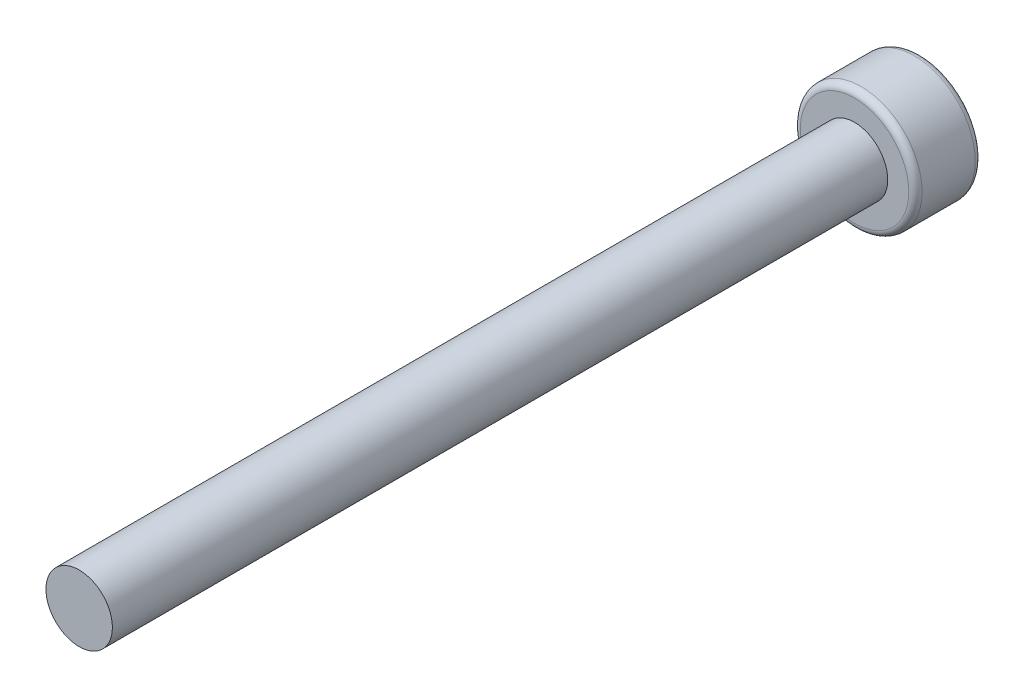
ISO-10303-21;
HEADER;
FILE_DESCRIPTION(('STEP AP214'),'2;1');
FILE_NAME('part.step','',(''),(''),'','','');
FILE_SCHEMA(('AUTOMOTIVE_DESIGN { 1 0 10303 214 1 1 1 1 }'));
ENDSEC;
DATA;
#1=APPLICATION_CONTEXT('core data for automotive mechanical design processes');
#2=APPLICATION_PROTOCOL_DEFINITION('international standard','automotive_design',2000,#1);
#3=PRODUCT_CONTEXT('',#1,'mechanical');
#4=PRODUCT('Part','Part','',(#3));
#5=PRODUCT_RELATED_PRODUCT_CATEGORY('part','',(#4));
#6=PRODUCT_DEFINITION_FORMATION('','',#4);
#7=PRODUCT_DEFINITION_CONTEXT('part definition',#1,'design');
#8=PRODUCT_DEFINITION('design','',#6,#7);
#9=PRODUCT_DEFINITION_SHAPE('','',#8);
#10=(LENGTH_UNIT() NAMED_UNIT(*) SI_UNIT(.MILLI.,.METRE.));
#11=(NAMED_UNIT(*) PLANE_ANGLE_UNIT() SI_UNIT($,.RADIAN.));
#12=(NAMED_UNIT(*) SI_UNIT($,.STERADIAN.) SOLID_ANGLE_UNIT());
#13=UNCERTAINTY_MEASURE_WITH_UNIT(LENGTH_MEASURE(1.E-05),#10,'distance_accuracy_value','');
#14=(GEOMETRIC_REPRESENTATION_CONTEXT(3) GLOBAL_UNCERTAINTY_ASSIGNED_CONTEXT((#13)) GLOBAL_UNIT_ASSIGNED_CONTEXT((#10,
#11,#12)) REPRESENTATION_CONTEXT('',''));
#15=CARTESIAN_POINT('',(0.,0.,0.));
#16=DIRECTION('',(0.,0.,1.));
#17=DIRECTION('',(1.,0.,0.));
#18=AXIS2_PLACEMENT_3D('',#15,#16,#17);
#19=CARTESIAN_POINT('',(0.,0.,3.));
#20=DIRECTION('',(0.,0.,-1.));
#21=DIRECTION('',(-1.,0.,0.));
#22=AXIS2_PLACEMENT_3D('',#19,#20,#21);
#23=CYLINDRICAL_SURFACE('',#22,2.75);
#24=CARTESIAN_POINT('',(0.,0.,0.3));
#25=DIRECTION('',(0.,0.,1.));
#26=DIRECTION('',(1.,0.,0.));
#27=AXIS2_PLACEMENT_3D('',#24,#25,#26);
#28=CIRCLE('',#27,2.75);
#29=CARTESIAN_POINT('',(2.75,0.,0.3));
#30=VERTEX_POINT('',#29);
#31=EDGE_CURVE('E155',#30,#30,#28,.T.);
#32=ORIENTED_EDGE('',*,*,#31,.T.);
#33=EDGE_LOOP('',(#32));
#34=FACE_BOUND('',#33,.T.);
#35=CARTESIAN_POINT('',(0.,0.,2.7));
#36=DIRECTION('',(0.,0.,1.));
#37=DIRECTION('',(1.,0.,0.));
#38=AXIS2_PLACEMENT_3D('',#35,#36,#37);
#39=CIRCLE('',#38,2.75);
#40=CARTESIAN_POINT('',(2.75,0.,2.7));
#41=VERTEX_POINT('',#40);
#42=EDGE_CURVE('E152',#41,#41,#39,.F.);
#43=ORIENTED_EDGE('',*,*,#42,.T.);
#44=EDGE_LOOP('',(#43));
#45=FACE_BOUND('',#44,.T.);
#46=ADVANCED_FACE('F39',(#34,#45),#23,.T.);
#47=CARTESIAN_POINT('',(0.,0.,3.));
#48=DIRECTION('',(0.,0.,1.));
#49=DIRECTION('',(1.,0.,0.));
#50=AXIS2_PLACEMENT_3D('',#47,#48,#49);
#51=PLANE('',#50);
#52=CARTESIAN_POINT('',(0.,0.,3.));
#53=DIRECTION('',(0.,0.,1.));
#54=DIRECTION('',(1.,0.,0.));
#55=AXIS2_PLACEMENT_3D('',#52,#53,#54);
#56=CIRCLE('',#55,2.45);
#57=CARTESIAN_POINT('',(2.45,0.,3.));
#58=VERTEX_POINT('',#57);
#59=EDGE_CURVE('E11',#58,#58,#56,.T.);
#60=ORIENTED_EDGE('',*,*,#59,.T.);
#61=EDGE_LOOP('',(#60));
#62=FACE_BOUND('',#61,.T.);
#63=CARTESIAN_POINT('',(0.,0.,3.));
#64=DIRECTION('',(0.,0.,1.));
#65=DIRECTION('',(1.,0.,0.));
#66=AXIS2_PLACEMENT_3D('',#63,#64,#65);
#67=CIRCLE('',#66,1.5);
#68=CARTESIAN_POINT('',(1.5,0.,3.));
#69=VERTEX_POINT('',#68);
#70=EDGE_CURVE('E149',#69,#69,#67,.T.);
#71=ORIENTED_EDGE('',*,*,#70,.F.);
#72=EDGE_LOOP('',(#71));
#73=FACE_BOUND('',#72,.T.);
#74=ADVANCED_FACE('F170',(#62,#73),#51,.T.);
#75=CARTESIAN_POINT('',(0.,0.,0.));
#76=DIRECTION('',(0.,0.,1.));
#77=DIRECTION('',(1.,0.,0.));
#78=AXIS2_PLACEMENT_3D('',#75,#76,#77);
#79=PLANE('',#78);
#80=DIRECTION('',(0.590811113127551,-0.806809908593706,0.));
#81=VECTOR('',#80,1.);
#82=CARTESIAN_POINT('',(0.820853493075304,1.8624081611757,0.));
#83=LINE('',#82,#81);
#84=CARTESIAN_POINT('',(0.820853493075304,1.8624081611757,0.));
#85=VERTEX_POINT('',#84);
#86=CARTESIAN_POINT('',(2.02331952633127,0.220324102799441,0.));
#87=VERTEX_POINT('',#86);
#88=EDGE_CURVE('E128',#85,#87,#83,.T.);
#89=ORIENTED_EDGE('',*,*,#88,.F.);
#90=DIRECTION('',(0.994123433430926,0.108252478509768,0.));
#91=VECTOR('',#90,1.);
#92=CARTESIAN_POINT('',(-1.20246603325596,1.64208405837626,0.));
#93=LINE('',#92,#91);
#94=CARTESIAN_POINT('',(-1.20246603325596,1.64208405837626,0.));
#95=VERTEX_POINT('',#94);
#96=EDGE_CURVE('E54',#95,#85,#93,.T.);
#97=ORIENTED_EDGE('',*,*,#96,.F.);
#98=DIRECTION('',(0.403312320303375,0.915062387103474,0.));
#99=VECTOR('',#98,1.);
#100=CARTESIAN_POINT('',(-2.02331952633127,-0.220324102799442,0.));
#101=LINE('',#100,#99);
#102=CARTESIAN_POINT('',(-2.02331952633127,-0.220324102799442,0.));
#103=VERTEX_POINT('',#102);
#104=EDGE_CURVE('E137',#103,#95,#101,.T.);
#105=ORIENTED_EDGE('',*,*,#104,.F.);
#106=DIRECTION('',(-0.590811113127551,0.806809908593706,0.));
#107=VECTOR('',#106,1.);
#108=CARTESIAN_POINT('',(-0.820853493075303,-1.8624081611757,0.));
#109=LINE('',#108,#107);
#110=CARTESIAN_POINT('',(-0.820853493075303,-1.8624081611757,0.));
#111=VERTEX_POINT('',#110);
#112=EDGE_CURVE('E135',#111,#103,#109,.T.);
#113=ORIENTED_EDGE('',*,*,#112,.F.);
#114=DIRECTION('',(-0.994123433430926,-0.108252478509768,0.));
#115=VECTOR('',#114,1.);
#116=CARTESIAN_POINT('',(1.20246603325596,-1.64208405837625,0.));
#117=LINE('',#116,#115);
#118=CARTESIAN_POINT('',(1.20246603325596,-1.64208405837625,0.));
#119=VERTEX_POINT('',#118);
#120=EDGE_CURVE('E102',#119,#111,#117,.T.);
#121=ORIENTED_EDGE('',*,*,#120,.F.);
#122=DIRECTION('',(-0.403312320303375,-0.915062387103474,0.));
#123=VECTOR('',#122,1.);
#124=CARTESIAN_POINT('',(2.02331952633127,0.220324102799441,0.));
#125=LINE('',#124,#123);
#126=EDGE_CURVE('E131',#87,#119,#125,.T.);
#127=ORIENTED_EDGE('',*,*,#126,.F.);
#128=EDGE_LOOP('',(#89,#97,#105,#113,#121,#127));
#129=FACE_BOUND('',#128,.T.);
#130=CARTESIAN_POINT('',(0.,0.,0.));
#131=DIRECTION('',(0.,0.,1.));
#132=DIRECTION('',(1.,0.,0.));
#133=AXIS2_PLACEMENT_3D('',#130,#131,#132);
#134=CIRCLE('',#133,2.45);
#135=CARTESIAN_POINT('',(2.45,0.,0.));
#136=VERTEX_POINT('',#135);
#137=EDGE_CURVE('E47',#136,#136,#134,.F.);
#138=ORIENTED_EDGE('',*,*,#137,.T.);
#139=EDGE_LOOP('',(#138));
#140=FACE_BOUND('',#139,.T.);
#141=ADVANCED_FACE('F160',(#129,#140),#79,.F.);
#142=CARTESIAN_POINT('',(0.,0.,38.));
#143=DIRECTION('',(0.,0.,-1.));
#144=DIRECTION('',(-1.,0.,0.));
#145=AXIS2_PLACEMENT_3D('',#142,#143,#144);
#146=CYLINDRICAL_SURFACE('',#145,1.5);
#147=CARTESIAN_POINT('',(0.,0.,38.));
#148=DIRECTION('',(0.,0.,1.));
#149=DIRECTION('',(1.,0.,0.));
#150=AXIS2_PLACEMENT_3D('',#147,#148,#149);
#151=CIRCLE('',#150,1.5);
#152=CARTESIAN_POINT('',(1.5,0.,38.));
#153=VERTEX_POINT('',#152);
#154=EDGE_CURVE('E141',#153,#153,#151,.T.);
#155=ORIENTED_EDGE('',*,*,#154,.F.);
#156=EDGE_LOOP('',(#155));
#157=FACE_BOUND('',#156,.T.);
#158=ORIENTED_EDGE('',*,*,#70,.T.);
#159=EDGE_LOOP('',(#158));
#160=FACE_BOUND('',#159,.T.);
#161=ADVANCED_FACE('F184',(#157,#160),#146,.T.);
#162=CARTESIAN_POINT('',(0.,0.,38.));
#163=DIRECTION('',(0.,0.,1.));
#164=DIRECTION('',(1.,0.,0.));
#165=AXIS2_PLACEMENT_3D('',#162,#163,#164);
#166=PLANE('',#165);
#167=ORIENTED_EDGE('',*,*,#154,.T.);
#168=EDGE_LOOP('',(#167));
#169=FACE_BOUND('',#168,.T.);
#170=ADVANCED_FACE('F165',(#169),#166,.T.);
#171=CARTESIAN_POINT('',(0.,0.,0.3));
#172=DIRECTION('',(0.,0.,1.));
#173=DIRECTION('',(1.,0.,0.));
#174=AXIS2_PLACEMENT_3D('',#171,#172,#173);
#175=TOROIDAL_SURFACE('',#174,2.45,0.3);
#176=ORIENTED_EDGE('',*,*,#137,.F.);
#177=EDGE_LOOP('',(#176));
#178=FACE_BOUND('',#177,.T.);
#179=ORIENTED_EDGE('',*,*,#31,.F.);
#180=EDGE_LOOP('',(#179));
#181=FACE_BOUND('',#180,.T.);
#182=ADVANCED_FACE('F162',(#178,#181),#175,.T.);
#183=CARTESIAN_POINT('',(0.,0.,2.7));
#184=DIRECTION('',(0.,0.,1.));
#185=DIRECTION('',(1.,0.,0.));
#186=AXIS2_PLACEMENT_3D('',#183,#184,#185);
#187=TOROIDAL_SURFACE('',#186,2.45,0.3);
#188=ORIENTED_EDGE('',*,*,#42,.F.);
#189=EDGE_LOOP('',(#188));
#190=FACE_BOUND('',#189,.T.);
#191=ORIENTED_EDGE('',*,*,#59,.F.);
#192=EDGE_LOOP('',(#191));
#193=FACE_BOUND('',#192,.T.);
#194=ADVANCED_FACE('F41',(#190,#193),#187,.T.);
#195=CARTESIAN_POINT('',(-1.20246603325596,1.64208405837626,2.));
#196=DIRECTION('',(-0.108252478509768,0.994123433430926,0.));
#197=DIRECTION('',(-0.994123433430926,-0.108252478509768,0.));
#198=AXIS2_PLACEMENT_3D('',#195,#196,#197);
#199=PLANE('',#198);
#200=ORIENTED_EDGE('',*,*,#96,.T.);
#201=DIRECTION('',(0.,0.,-1.));
#202=VECTOR('',#201,1.);
#203=CARTESIAN_POINT('',(0.820853493075304,1.8624081611757,2.));
#204=LINE('',#203,#202);
#205=CARTESIAN_POINT('',(0.820853493075304,1.8624081611757,2.));
#206=VERTEX_POINT('',#205);
#207=EDGE_CURVE('E84',#206,#85,#204,.T.);
#208=ORIENTED_EDGE('',*,*,#207,.F.);
#209=DIRECTION('',(0.994123433430926,0.108252478509768,0.));
#210=VECTOR('',#209,1.);
#211=CARTESIAN_POINT('',(-1.20246603325596,1.64208405837626,2.));
#212=LINE('',#211,#210);
#213=CARTESIAN_POINT('',(-1.20246603325596,1.64208405837626,2.));
#214=VERTEX_POINT('',#213);
#215=EDGE_CURVE('E139',#214,#206,#212,.T.);
#216=ORIENTED_EDGE('',*,*,#215,.F.);
#217=DIRECTION('',(0.,0.,-1.));
#218=VECTOR('',#217,1.);
#219=CARTESIAN_POINT('',(-1.20246603325596,1.64208405837626,2.));
#220=LINE('',#219,#218);
#221=EDGE_CURVE('E62',#214,#95,#220,.T.);
#222=ORIENTED_EDGE('',*,*,#221,.T.);
#223=EDGE_LOOP('',(#200,#208,#216,#222));
#224=FACE_BOUND('',#223,.T.);
#225=ADVANCED_FACE('F176',(#224),#199,.F.);
#226=CARTESIAN_POINT('',(-2.02331952633127,-0.220324102799442,2.));
#227=DIRECTION('',(-0.915062387103474,0.403312320303375,0.));
#228=DIRECTION('',(-0.403312320303375,-0.915062387103474,0.));
#229=AXIS2_PLACEMENT_3D('',#226,#227,#228);
#230=PLANE('',#229);
#231=ORIENTED_EDGE('',*,*,#104,.T.);
#232=ORIENTED_EDGE('',*,*,#221,.F.);
#233=DIRECTION('',(0.403312320303375,0.915062387103474,0.));
#234=VECTOR('',#233,1.);
#235=CARTESIAN_POINT('',(-2.02331952633127,-0.220324102799442,2.));
#236=LINE('',#235,#234);
#237=CARTESIAN_POINT('',(-2.02331952633127,-0.220324102799442,2.));
#238=VERTEX_POINT('',#237);
#239=EDGE_CURVE('E114',#238,#214,#236,.T.);
#240=ORIENTED_EDGE('',*,*,#239,.F.);
#241=DIRECTION('',(0.,0.,-1.));
#242=VECTOR('',#241,1.);
#243=CARTESIAN_POINT('',(-2.02331952633127,-0.220324102799442,2.));
#244=LINE('',#243,#242);
#245=EDGE_CURVE('E106',#238,#103,#244,.T.);
#246=ORIENTED_EDGE('',*,*,#245,.T.);
#247=EDGE_LOOP('',(#231,#232,#240,#246));
#248=FACE_BOUND('',#247,.T.);
#249=ADVANCED_FACE('F200',(#248),#230,.F.);
#250=CARTESIAN_POINT('',(-0.820853493075303,-1.8624081611757,2.));
#251=DIRECTION('',(-0.806809908593706,-0.590811113127551,0.));
#252=DIRECTION('',(0.590811113127551,-0.806809908593706,0.));
#253=AXIS2_PLACEMENT_3D('',#250,#251,#252);
#254=PLANE('',#253);
#255=ORIENTED_EDGE('',*,*,#112,.T.);
#256=ORIENTED_EDGE('',*,*,#245,.F.);
#257=DIRECTION('',(-0.590811113127551,0.806809908593706,0.));
#258=VECTOR('',#257,1.);
#259=CARTESIAN_POINT('',(-0.820853493075303,-1.8624081611757,2.));
#260=LINE('',#259,#258);
#261=CARTESIAN_POINT('',(-0.820853493075303,-1.8624081611757,2.));
#262=VERTEX_POINT('',#261);
#263=EDGE_CURVE('E110',#262,#238,#260,.T.);
#264=ORIENTED_EDGE('',*,*,#263,.F.);
#265=DIRECTION('',(0.,0.,-1.));
#266=VECTOR('',#265,1.);
#267=CARTESIAN_POINT('',(-0.820853493075303,-1.8624081611757,2.));
#268=LINE('',#267,#266);
#269=EDGE_CURVE('E95',#262,#111,#268,.T.);
#270=ORIENTED_EDGE('',*,*,#269,.T.);
#271=EDGE_LOOP('',(#255,#256,#264,#270));
#272=FACE_BOUND('',#271,.T.);
#273=ADVANCED_FACE('F111',(#272),#254,.F.);
#274=CARTESIAN_POINT('',(1.20246603325596,-1.64208405837625,2.));
#275=DIRECTION('',(0.108252478509768,-0.994123433430926,0.));
#276=DIRECTION('',(0.994123433430926,0.108252478509768,0.));
#277=AXIS2_PLACEMENT_3D('',#274,#275,#276);
#278=PLANE('',#277);
#279=ORIENTED_EDGE('',*,*,#120,.T.);
#280=ORIENTED_EDGE('',*,*,#269,.F.);
#281=DIRECTION('',(-0.994123433430926,-0.108252478509768,0.));
#282=VECTOR('',#281,1.);
#283=CARTESIAN_POINT('',(1.20246603325596,-1.64208405837625,2.));
#284=LINE('',#283,#282);
#285=CARTESIAN_POINT('',(1.20246603325596,-1.64208405837625,2.));
#286=VERTEX_POINT('',#285);
#287=EDGE_CURVE('E99',#286,#262,#284,.T.);
#288=ORIENTED_EDGE('',*,*,#287,.F.);
#289=DIRECTION('',(0.,0.,-1.));
#290=VECTOR('',#289,1.);
#291=CARTESIAN_POINT('',(1.20246603325596,-1.64208405837625,2.));
#292=LINE('',#291,#290);
#293=EDGE_CURVE('E107',#286,#119,#292,.T.);
#294=ORIENTED_EDGE('',*,*,#293,.T.);
#295=EDGE_LOOP('',(#279,#280,#288,#294));
#296=FACE_BOUND('',#295,.T.);
#297=ADVANCED_FACE('F97',(#296),#278,.F.);
#298=CARTESIAN_POINT('',(2.02331952633127,0.220324102799441,2.));
#299=DIRECTION('',(0.915062387103474,-0.403312320303375,0.));
#300=DIRECTION('',(0.403312320303375,0.915062387103474,0.));
#301=AXIS2_PLACEMENT_3D('',#298,#299,#300);
#302=PLANE('',#301);
#303=ORIENTED_EDGE('',*,*,#126,.T.);
#304=ORIENTED_EDGE('',*,*,#293,.F.);
#305=DIRECTION('',(-0.403312320303375,-0.915062387103474,0.));
#306=VECTOR('',#305,1.);
#307=CARTESIAN_POINT('',(2.02331952633127,0.220324102799441,2.));
#308=LINE('',#307,#306);
#309=CARTESIAN_POINT('',(2.02331952633127,0.220324102799441,2.));
#310=VERTEX_POINT('',#309);
#311=EDGE_CURVE('E120',#310,#286,#308,.T.);
#312=ORIENTED_EDGE('',*,*,#311,.F.);
#313=DIRECTION('',(0.,0.,-1.));
#314=VECTOR('',#313,1.);
#315=CARTESIAN_POINT('',(2.02331952633127,0.220324102799441,2.));
#316=LINE('',#315,#314);
#317=EDGE_CURVE('E144',#310,#87,#316,.T.);
#318=ORIENTED_EDGE('',*,*,#317,.T.);
#319=EDGE_LOOP('',(#303,#304,#312,#318));
#320=FACE_BOUND('',#319,.T.);
#321=ADVANCED_FACE('F204',(#320),#302,.F.);
#322=CARTESIAN_POINT('',(0.820853493075304,1.8624081611757,2.));
#323=DIRECTION('',(0.806809908593706,0.590811113127551,0.));
#324=DIRECTION('',(-0.590811113127551,0.806809908593706,0.));
#325=AXIS2_PLACEMENT_3D('',#322,#323,#324);
#326=PLANE('',#325);
#327=ORIENTED_EDGE('',*,*,#88,.T.);
#328=ORIENTED_EDGE('',*,*,#317,.F.);
#329=DIRECTION('',(0.590811113127551,-0.806809908593706,0.));
#330=VECTOR('',#329,1.);
#331=CARTESIAN_POINT('',(0.820853493075304,1.8624081611757,2.));
#332=LINE('',#331,#330);
#333=EDGE_CURVE('E122',#206,#310,#332,.T.);
#334=ORIENTED_EDGE('',*,*,#333,.F.);
#335=ORIENTED_EDGE('',*,*,#207,.T.);
#336=EDGE_LOOP('',(#327,#328,#334,#335));
#337=FACE_BOUND('',#336,.T.);
#338=ADVANCED_FACE('F201',(#337),#326,.F.);
#339=CARTESIAN_POINT('',(0.,0.,2.));
#340=DIRECTION('',(0.,0.,-1.));
#341=DIRECTION('',(-1.,0.,0.));
#342=AXIS2_PLACEMENT_3D('',#339,#340,#341);
#343=PLANE('',#342);
#344=ORIENTED_EDGE('',*,*,#215,.T.);
#345=ORIENTED_EDGE('',*,*,#333,.T.);
#346=ORIENTED_EDGE('',*,*,#311,.T.);
#347=ORIENTED_EDGE('',*,*,#287,.T.);
#348=ORIENTED_EDGE('',*,*,#263,.T.);
#349=ORIENTED_EDGE('',*,*,#239,.T.);
#350=EDGE_LOOP('',(#344,#345,#346,#347,#348,#349));
#351=FACE_BOUND('',#350,.T.);
#352=ADVANCED_FACE('F117',(#351),#343,.T.);
#353=CLOSED_SHELL('',(#46,#74,#141,#161,#170,#182,#194,#225,#249,#273,#297,#321,#338,#352));
#354=MANIFOLD_SOLID_BREP('B2',#353);
#355=ADVANCED_BREP_SHAPE_REPRESENTATION('',(#18,#354),#14);
#356=SHAPE_DEFINITION_REPRESENTATION(#9,#355);
ENDSEC;
END-ISO-10303-21;
